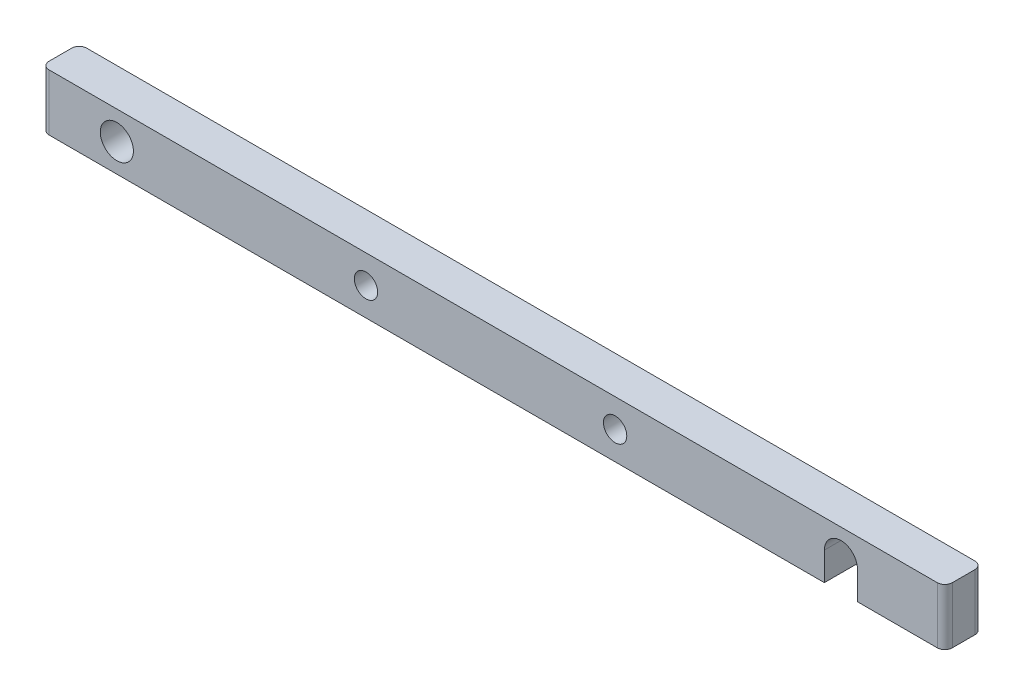
ISO-10303-21;
HEADER;
FILE_DESCRIPTION(('STEP AP214'),'2;1');
FILE_NAME('part.step','',(''),(''),'','','');
FILE_SCHEMA(('AUTOMOTIVE_DESIGN { 1 0 10303 214 1 1 1 1 }'));
ENDSEC;
DATA;
#1=APPLICATION_CONTEXT('core data for automotive mechanical design processes');
#2=APPLICATION_PROTOCOL_DEFINITION('international standard','automotive_design',2000,#1);
#3=PRODUCT_CONTEXT('',#1,'mechanical');
#4=PRODUCT('Part','Part','',(#3));
#5=PRODUCT_RELATED_PRODUCT_CATEGORY('part','',(#4));
#6=PRODUCT_DEFINITION_FORMATION('','',#4);
#7=PRODUCT_DEFINITION_CONTEXT('part definition',#1,'design');
#8=PRODUCT_DEFINITION('design','',#6,#7);
#9=PRODUCT_DEFINITION_SHAPE('','',#8);
#10=(LENGTH_UNIT() NAMED_UNIT(*) SI_UNIT(.MILLI.,.METRE.));
#11=(NAMED_UNIT(*) PLANE_ANGLE_UNIT() SI_UNIT($,.RADIAN.));
#12=(NAMED_UNIT(*) SI_UNIT($,.STERADIAN.) SOLID_ANGLE_UNIT());
#13=UNCERTAINTY_MEASURE_WITH_UNIT(LENGTH_MEASURE(1.E-05),#10,'distance_accuracy_value','');
#14=(GEOMETRIC_REPRESENTATION_CONTEXT(3) GLOBAL_UNCERTAINTY_ASSIGNED_CONTEXT((#13)) GLOBAL_UNIT_ASSIGNED_CONTEXT((#10,
#11,#12)) REPRESENTATION_CONTEXT('',''));
#15=CARTESIAN_POINT('',(0.,0.,0.));
#16=DIRECTION('',(0.,0.,1.));
#17=DIRECTION('',(1.,0.,0.));
#18=AXIS2_PLACEMENT_3D('',#15,#16,#17);
#19=CARTESIAN_POINT('',(-152.4,-9.525,6.35));
#20=DIRECTION('',(0.,1.,0.));
#21=DIRECTION('',(0.,0.,1.));
#22=AXIS2_PLACEMENT_3D('',#19,#20,#21);
#23=PLANE('',#22);
#24=DIRECTION('',(1.,0.,0.));
#25=VECTOR('',#24,1.);
#26=CARTESIAN_POINT('',(-152.4,-9.525,-6.35));
#27=LINE('',#26,#25);
#28=CARTESIAN_POINT('',(122.936,-9.525,-6.35));
#29=VERTEX_POINT('',#28);
#30=CARTESIAN_POINT('',(149.86,-9.525,-6.35));
#31=VERTEX_POINT('',#30);
#32=EDGE_CURVE('E143',#29,#31,#27,.T.);
#33=ORIENTED_EDGE('',*,*,#32,.T.);
#34=CARTESIAN_POINT('',(149.86,-9.525,-3.81));
#35=DIRECTION('',(0.,1.,0.));
#36=DIRECTION('',(0.,0.,1.));
#37=AXIS2_PLACEMENT_3D('',#34,#35,#36);
#38=CIRCLE('',#37,2.54);
#39=CARTESIAN_POINT('',(152.4,-9.525,-3.81));
#40=VERTEX_POINT('',#39);
#41=EDGE_CURVE('E11',#31,#40,#38,.F.);
#42=ORIENTED_EDGE('',*,*,#41,.T.);
#43=DIRECTION('',(0.,0.,-1.));
#44=VECTOR('',#43,1.);
#45=CARTESIAN_POINT('',(152.4,-9.525,6.35));
#46=LINE('',#45,#44);
#47=CARTESIAN_POINT('',(152.4,-9.525,3.81));
#48=VERTEX_POINT('',#47);
#49=EDGE_CURVE('E166',#48,#40,#46,.T.);
#50=ORIENTED_EDGE('',*,*,#49,.F.);
#51=CARTESIAN_POINT('',(149.86,-9.525,3.81));
#52=DIRECTION('',(0.,1.,0.));
#53=DIRECTION('',(0.,0.,1.));
#54=AXIS2_PLACEMENT_3D('',#51,#52,#53);
#55=CIRCLE('',#54,2.54);
#56=CARTESIAN_POINT('',(149.86,-9.525,6.35));
#57=VERTEX_POINT('',#56);
#58=EDGE_CURVE('E48',#48,#57,#55,.F.);
#59=ORIENTED_EDGE('',*,*,#58,.T.);
#60=DIRECTION('',(1.,0.,0.));
#61=VECTOR('',#60,1.);
#62=CARTESIAN_POINT('',(-152.4,-9.525,6.35));
#63=LINE('',#62,#61);
#64=CARTESIAN_POINT('',(122.936,-9.525,6.35));
#65=VERTEX_POINT('',#64);
#66=EDGE_CURVE('E145',#65,#57,#63,.T.);
#67=ORIENTED_EDGE('',*,*,#66,.F.);
#68=DIRECTION('',(0.,0.,1.));
#69=VECTOR('',#68,1.);
#70=CARTESIAN_POINT('',(122.936,-9.525,-6.35));
#71=LINE('',#70,#69);
#72=EDGE_CURVE('E132',#29,#65,#71,.T.);
#73=ORIENTED_EDGE('',*,*,#72,.F.);
#74=EDGE_LOOP('',(#33,#42,#50,#59,#67,#73));
#75=FACE_BOUND('',#74,.T.);
#76=ADVANCED_FACE('F39',(#75),#23,.F.);
#77=CARTESIAN_POINT('',(152.4,-9.525,6.35));
#78=DIRECTION('',(-1.,0.,0.));
#79=DIRECTION('',(0.,0.,1.));
#80=AXIS2_PLACEMENT_3D('',#77,#78,#79);
#81=PLANE('',#80);
#82=ORIENTED_EDGE('',*,*,#49,.T.);
#83=DIRECTION('',(0.,1.,0.));
#84=VECTOR('',#83,1.);
#85=CARTESIAN_POINT('',(152.4,9.525,-3.81));
#86=LINE('',#85,#84);
#87=CARTESIAN_POINT('',(152.4,9.525,-3.81));
#88=VERTEX_POINT('',#87);
#89=EDGE_CURVE('E228',#40,#88,#86,.T.);
#90=ORIENTED_EDGE('',*,*,#89,.T.);
#91=DIRECTION('',(0.,0.,-1.));
#92=VECTOR('',#91,1.);
#93=CARTESIAN_POINT('',(152.4,9.525,6.35));
#94=LINE('',#93,#92);
#95=CARTESIAN_POINT('',(152.4,9.525,3.81));
#96=VERTEX_POINT('',#95);
#97=EDGE_CURVE('E178',#96,#88,#94,.T.);
#98=ORIENTED_EDGE('',*,*,#97,.F.);
#99=DIRECTION('',(0.,1.,0.));
#100=VECTOR('',#99,1.);
#101=CARTESIAN_POINT('',(152.4,-9.525,3.81));
#102=LINE('',#101,#100);
#103=EDGE_CURVE('E60',#96,#48,#102,.F.);
#104=ORIENTED_EDGE('',*,*,#103,.T.);
#105=EDGE_LOOP('',(#82,#90,#98,#104));
#106=FACE_BOUND('',#105,.T.);
#107=ADVANCED_FACE('F243',(#106),#81,.F.);
#108=CARTESIAN_POINT('',(-152.4,9.525,6.35));
#109=DIRECTION('',(0.,-1.,0.));
#110=DIRECTION('',(0.,0.,-1.));
#111=AXIS2_PLACEMENT_3D('',#108,#109,#110);
#112=PLANE('',#111);
#113=DIRECTION('',(-1.,0.,0.));
#114=VECTOR('',#113,1.);
#115=CARTESIAN_POINT('',(-152.4,9.525,-6.35));
#116=LINE('',#115,#114);
#117=CARTESIAN_POINT('',(149.86,9.525,-6.35));
#118=VERTEX_POINT('',#117);
#119=CARTESIAN_POINT('',(-149.86,9.525,-6.35));
#120=VERTEX_POINT('',#119);
#121=EDGE_CURVE('E156',#118,#120,#116,.T.);
#122=ORIENTED_EDGE('',*,*,#121,.T.);
#123=CARTESIAN_POINT('',(-149.86,9.525,-3.81));
#124=DIRECTION('',(0.,-1.,0.));
#125=DIRECTION('',(0.,0.,-1.));
#126=AXIS2_PLACEMENT_3D('',#123,#124,#125);
#127=CIRCLE('',#126,2.54);
#128=CARTESIAN_POINT('',(-152.4,9.525,-3.81));
#129=VERTEX_POINT('',#128);
#130=EDGE_CURVE('E215',#120,#129,#127,.F.);
#131=ORIENTED_EDGE('',*,*,#130,.T.);
#132=DIRECTION('',(0.,0.,-1.));
#133=VECTOR('',#132,1.);
#134=CARTESIAN_POINT('',(-152.4,9.525,6.35));
#135=LINE('',#134,#133);
#136=CARTESIAN_POINT('',(-152.4,9.525,3.81));
#137=VERTEX_POINT('',#136);
#138=EDGE_CURVE('E174',#137,#129,#135,.T.);
#139=ORIENTED_EDGE('',*,*,#138,.F.);
#140=CARTESIAN_POINT('',(-149.86,9.525,3.81));
#141=DIRECTION('',(0.,-1.,0.));
#142=DIRECTION('',(0.,0.,-1.));
#143=AXIS2_PLACEMENT_3D('',#140,#141,#142);
#144=CIRCLE('',#143,2.54);
#145=CARTESIAN_POINT('',(-149.86,9.525,6.35));
#146=VERTEX_POINT('',#145);
#147=EDGE_CURVE('E212',#137,#146,#144,.F.);
#148=ORIENTED_EDGE('',*,*,#147,.T.);
#149=DIRECTION('',(-1.,0.,0.));
#150=VECTOR('',#149,1.);
#151=CARTESIAN_POINT('',(-152.4,9.525,6.35));
#152=LINE('',#151,#150);
#153=CARTESIAN_POINT('',(149.86,9.525,6.35));
#154=VERTEX_POINT('',#153);
#155=EDGE_CURVE('E160',#154,#146,#152,.T.);
#156=ORIENTED_EDGE('',*,*,#155,.F.);
#157=CARTESIAN_POINT('',(149.86,9.525,3.81));
#158=DIRECTION('',(0.,-1.,0.));
#159=DIRECTION('',(0.,0.,-1.));
#160=AXIS2_PLACEMENT_3D('',#157,#158,#159);
#161=CIRCLE('',#160,2.54);
#162=EDGE_CURVE('E206',#154,#96,#161,.F.);
#163=ORIENTED_EDGE('',*,*,#162,.T.);
#164=ORIENTED_EDGE('',*,*,#97,.T.);
#165=CARTESIAN_POINT('',(149.86,9.525,-3.81));
#166=DIRECTION('',(0.,-1.,0.));
#167=DIRECTION('',(0.,0.,-1.));
#168=AXIS2_PLACEMENT_3D('',#165,#166,#167);
#169=CIRCLE('',#168,2.54);
#170=EDGE_CURVE('E209',#88,#118,#169,.F.);
#171=ORIENTED_EDGE('',*,*,#170,.T.);
#172=EDGE_LOOP('',(#122,#131,#139,#148,#156,#163,#164,#171));
#173=FACE_BOUND('',#172,.T.);
#174=ADVANCED_FACE('F242',(#173),#112,.F.);
#175=CARTESIAN_POINT('',(-152.4,-9.525,6.35));
#176=DIRECTION('',(1.,0.,0.));
#177=DIRECTION('',(0.,0.,-1.));
#178=AXIS2_PLACEMENT_3D('',#175,#176,#177);
#179=PLANE('',#178);
#180=ORIENTED_EDGE('',*,*,#138,.T.);
#181=DIRECTION('',(0.,-1.,0.));
#182=VECTOR('',#181,1.);
#183=CARTESIAN_POINT('',(-152.4,-9.525,-3.81));
#184=LINE('',#183,#182);
#185=CARTESIAN_POINT('',(-152.4,-9.525,-3.81));
#186=VERTEX_POINT('',#185);
#187=EDGE_CURVE('E191',#129,#186,#184,.T.);
#188=ORIENTED_EDGE('',*,*,#187,.T.);
#189=DIRECTION('',(0.,0.,-1.));
#190=VECTOR('',#189,1.);
#191=CARTESIAN_POINT('',(-152.4,-9.525,6.35));
#192=LINE('',#191,#190);
#193=CARTESIAN_POINT('',(-152.4,-9.525,3.81));
#194=VERTEX_POINT('',#193);
#195=EDGE_CURVE('E169',#194,#186,#192,.T.);
#196=ORIENTED_EDGE('',*,*,#195,.F.);
#197=DIRECTION('',(0.,-1.,0.));
#198=VECTOR('',#197,1.);
#199=CARTESIAN_POINT('',(-152.4,-9.525,3.81));
#200=LINE('',#199,#198);
#201=EDGE_CURVE('E182',#194,#137,#200,.F.);
#202=ORIENTED_EDGE('',*,*,#201,.T.);
#203=EDGE_LOOP('',(#180,#188,#196,#202));
#204=FACE_BOUND('',#203,.T.);
#205=ADVANCED_FACE('F256',(#204),#179,.F.);
#206=ORIENTED_EDGE('',*,*,#195,.T.);
#207=CARTESIAN_POINT('',(-149.86,-9.525,-3.81));
#208=DIRECTION('',(0.,1.,0.));
#209=DIRECTION('',(0.,0.,1.));
#210=AXIS2_PLACEMENT_3D('',#207,#208,#209);
#211=CIRCLE('',#210,2.54);
#212=CARTESIAN_POINT('',(-149.86,-9.525,-6.35));
#213=VERTEX_POINT('',#212);
#214=EDGE_CURVE('E198',#186,#213,#211,.F.);
#215=ORIENTED_EDGE('',*,*,#214,.T.);
#216=CARTESIAN_POINT('',(111.76,-9.525,-6.35));
#217=VERTEX_POINT('',#216);
#218=EDGE_CURVE('E155',#213,#217,#27,.T.);
#219=ORIENTED_EDGE('',*,*,#218,.T.);
#220=DIRECTION('',(0.,0.,1.));
#221=VECTOR('',#220,1.);
#222=CARTESIAN_POINT('',(111.76,-9.525,-6.35));
#223=LINE('',#222,#221);
#224=CARTESIAN_POINT('',(111.76,-9.525,6.35));
#225=VERTEX_POINT('',#224);
#226=EDGE_CURVE('E276',#217,#225,#223,.T.);
#227=ORIENTED_EDGE('',*,*,#226,.T.);
#228=CARTESIAN_POINT('',(-149.86,-9.525,6.35));
#229=VERTEX_POINT('',#228);
#230=EDGE_CURVE('E170',#229,#225,#63,.T.);
#231=ORIENTED_EDGE('',*,*,#230,.F.);
#232=CARTESIAN_POINT('',(-149.86,-9.525,3.81));
#233=DIRECTION('',(0.,1.,0.));
#234=DIRECTION('',(0.,0.,1.));
#235=AXIS2_PLACEMENT_3D('',#232,#233,#234);
#236=CIRCLE('',#235,2.54);
#237=EDGE_CURVE('E195',#229,#194,#236,.F.);
#238=ORIENTED_EDGE('',*,*,#237,.T.);
#239=EDGE_LOOP('',(#206,#215,#219,#227,#231,#238));
#240=FACE_BOUND('',#239,.T.);
#241=ADVANCED_FACE('F281',(#240),#23,.F.);
#242=CARTESIAN_POINT('',(0.,0.,6.35));
#243=DIRECTION('',(0.,0.,-1.));
#244=DIRECTION('',(-1.,0.,0.));
#245=AXIS2_PLACEMENT_3D('',#242,#243,#244);
#246=PLANE('',#245);
#247=CARTESIAN_POINT('',(-127.,0.,6.35));
#248=DIRECTION('',(0.,0.,-1.));
#249=DIRECTION('',(-1.,0.,0.));
#250=AXIS2_PLACEMENT_3D('',#247,#248,#249);
#251=CIRCLE('',#250,5.58799999999999);
#252=CARTESIAN_POINT('',(-132.588,0.,6.35));
#253=VERTEX_POINT('',#252);
#254=EDGE_CURVE('E162',#253,#253,#251,.T.);
#255=ORIENTED_EDGE('',*,*,#254,.T.);
#256=EDGE_LOOP('',(#255));
#257=FACE_BOUND('',#256,.T.);
#258=CARTESIAN_POINT('',(-42.9260000000001,0.,6.35));
#259=DIRECTION('',(0.,0.,-1.));
#260=DIRECTION('',(-1.,0.,0.));
#261=AXIS2_PLACEMENT_3D('',#258,#259,#260);
#262=CIRCLE('',#261,3.937);
#263=CARTESIAN_POINT('',(-46.8630000000001,0.,6.35));
#264=VERTEX_POINT('',#263);
#265=EDGE_CURVE('E301',#264,#264,#262,.T.);
#266=ORIENTED_EDGE('',*,*,#265,.T.);
#267=EDGE_LOOP('',(#266));
#268=FACE_BOUND('',#267,.T.);
#269=CARTESIAN_POINT('',(41.1479999999999,0.,6.35));
#270=DIRECTION('',(0.,0.,-1.));
#271=DIRECTION('',(-1.,0.,0.));
#272=AXIS2_PLACEMENT_3D('',#269,#270,#271);
#273=CIRCLE('',#272,3.93699999999999);
#274=CARTESIAN_POINT('',(37.2109999999999,0.,6.35));
#275=VERTEX_POINT('',#274);
#276=EDGE_CURVE('E279',#275,#275,#273,.T.);
#277=ORIENTED_EDGE('',*,*,#276,.T.);
#278=EDGE_LOOP('',(#277));
#279=FACE_BOUND('',#278,.T.);
#280=ORIENTED_EDGE('',*,*,#155,.T.);
#281=DIRECTION('',(0.,-1.,0.));
#282=VECTOR('',#281,1.);
#283=CARTESIAN_POINT('',(-149.86,0.,6.35));
#284=LINE('',#283,#282);
#285=EDGE_CURVE('E222',#146,#229,#284,.T.);
#286=ORIENTED_EDGE('',*,*,#285,.T.);
#287=ORIENTED_EDGE('',*,*,#230,.T.);
#288=DIRECTION('',(0.,1.,0.));
#289=VECTOR('',#288,1.);
#290=CARTESIAN_POINT('',(111.76,0.,6.35));
#291=LINE('',#290,#289);
#292=CARTESIAN_POINT('',(111.76,0.,6.35));
#293=VERTEX_POINT('',#292);
#294=EDGE_CURVE('E187',#225,#293,#291,.T.);
#295=ORIENTED_EDGE('',*,*,#294,.T.);
#296=CARTESIAN_POINT('',(117.348,0.,6.35));
#297=DIRECTION('',(0.,0.,1.));
#298=DIRECTION('',(1.,0.,0.));
#299=AXIS2_PLACEMENT_3D('',#296,#297,#298);
#300=CIRCLE('',#299,5.588);
#301=CARTESIAN_POINT('',(122.936,0.,6.35));
#302=VERTEX_POINT('',#301);
#303=EDGE_CURVE('E183',#302,#293,#300,.T.);
#304=ORIENTED_EDGE('',*,*,#303,.F.);
#305=DIRECTION('',(0.,1.,0.));
#306=VECTOR('',#305,1.);
#307=CARTESIAN_POINT('',(122.936,0.,6.35));
#308=LINE('',#307,#306);
#309=EDGE_CURVE('E188',#65,#302,#308,.T.);
#310=ORIENTED_EDGE('',*,*,#309,.F.);
#311=ORIENTED_EDGE('',*,*,#66,.T.);
#312=DIRECTION('',(0.,1.,0.));
#313=VECTOR('',#312,1.);
#314=CARTESIAN_POINT('',(149.86,0.,6.35));
#315=LINE('',#314,#313);
#316=EDGE_CURVE('E218',#57,#154,#315,.T.);
#317=ORIENTED_EDGE('',*,*,#316,.T.);
#318=EDGE_LOOP('',(#280,#286,#287,#295,#304,#310,#311,#317));
#319=FACE_BOUND('',#318,.T.);
#320=ADVANCED_FACE('F237',(#257,#268,#279,#319),#246,.F.);
#321=CARTESIAN_POINT('',(0.,0.,-6.35));
#322=DIRECTION('',(0.,0.,-1.));
#323=DIRECTION('',(-1.,0.,0.));
#324=AXIS2_PLACEMENT_3D('',#321,#322,#323);
#325=PLANE('',#324);
#326=CARTESIAN_POINT('',(-127.,0.,-6.35));
#327=DIRECTION('',(0.,0.,1.));
#328=DIRECTION('',(1.,0.,0.));
#329=AXIS2_PLACEMENT_3D('',#326,#327,#328);
#330=CIRCLE('',#329,5.58799999999999);
#331=CARTESIAN_POINT('',(-121.412,0.,-6.35));
#332=VERTEX_POINT('',#331);
#333=EDGE_CURVE('E297',#332,#332,#330,.T.);
#334=ORIENTED_EDGE('',*,*,#333,.T.);
#335=EDGE_LOOP('',(#334));
#336=FACE_BOUND('',#335,.T.);
#337=CARTESIAN_POINT('',(-42.9260000000001,0.,-6.35));
#338=DIRECTION('',(0.,0.,1.));
#339=DIRECTION('',(1.,0.,0.));
#340=AXIS2_PLACEMENT_3D('',#337,#338,#339);
#341=CIRCLE('',#340,3.937);
#342=CARTESIAN_POINT('',(-38.9890000000001,0.,-6.35));
#343=VERTEX_POINT('',#342);
#344=EDGE_CURVE('E288',#343,#343,#341,.T.);
#345=ORIENTED_EDGE('',*,*,#344,.T.);
#346=EDGE_LOOP('',(#345));
#347=FACE_BOUND('',#346,.T.);
#348=CARTESIAN_POINT('',(41.1479999999999,0.,-6.35));
#349=DIRECTION('',(0.,0.,1.));
#350=DIRECTION('',(1.,0.,0.));
#351=AXIS2_PLACEMENT_3D('',#348,#349,#350);
#352=CIRCLE('',#351,3.93699999999999);
#353=CARTESIAN_POINT('',(45.0849999999999,0.,-6.35));
#354=VERTEX_POINT('',#353);
#355=EDGE_CURVE('E283',#354,#354,#352,.T.);
#356=ORIENTED_EDGE('',*,*,#355,.T.);
#357=EDGE_LOOP('',(#356));
#358=FACE_BOUND('',#357,.T.);
#359=ORIENTED_EDGE('',*,*,#218,.F.);
#360=DIRECTION('',(0.,-1.,0.));
#361=VECTOR('',#360,1.);
#362=CARTESIAN_POINT('',(-149.86,9.525,-6.35));
#363=LINE('',#362,#361);
#364=EDGE_CURVE('E203',#213,#120,#363,.F.);
#365=ORIENTED_EDGE('',*,*,#364,.T.);
#366=ORIENTED_EDGE('',*,*,#121,.F.);
#367=DIRECTION('',(0.,1.,0.));
#368=VECTOR('',#367,1.);
#369=CARTESIAN_POINT('',(149.86,-9.525,-6.35));
#370=LINE('',#369,#368);
#371=EDGE_CURVE('E153',#118,#31,#370,.F.);
#372=ORIENTED_EDGE('',*,*,#371,.T.);
#373=ORIENTED_EDGE('',*,*,#32,.F.);
#374=DIRECTION('',(0.,-1.,0.));
#375=VECTOR('',#374,1.);
#376=CARTESIAN_POINT('',(122.936,0.,-6.35));
#377=LINE('',#376,#375);
#378=CARTESIAN_POINT('',(122.936,0.,-6.35));
#379=VERTEX_POINT('',#378);
#380=EDGE_CURVE('E129',#379,#29,#377,.T.);
#381=ORIENTED_EDGE('',*,*,#380,.F.);
#382=CARTESIAN_POINT('',(117.348,0.,-6.35));
#383=DIRECTION('',(0.,0.,1.));
#384=DIRECTION('',(1.,0.,0.));
#385=AXIS2_PLACEMENT_3D('',#382,#383,#384);
#386=CIRCLE('',#385,5.588);
#387=CARTESIAN_POINT('',(111.76,0.,-6.35));
#388=VERTEX_POINT('',#387);
#389=EDGE_CURVE('E140',#379,#388,#386,.T.);
#390=ORIENTED_EDGE('',*,*,#389,.T.);
#391=DIRECTION('',(0.,-1.,0.));
#392=VECTOR('',#391,1.);
#393=CARTESIAN_POINT('',(111.76,0.,-6.35));
#394=LINE('',#393,#392);
#395=EDGE_CURVE('E147',#388,#217,#394,.T.);
#396=ORIENTED_EDGE('',*,*,#395,.T.);
#397=EDGE_LOOP('',(#359,#365,#366,#372,#373,#381,#390,#396));
#398=FACE_BOUND('',#397,.T.);
#399=ADVANCED_FACE('F150',(#336,#347,#358,#398),#325,.T.);
#400=CARTESIAN_POINT('',(111.76,0.,-6.35));
#401=DIRECTION('',(-1.,0.,0.));
#402=DIRECTION('',(0.,0.,1.));
#403=AXIS2_PLACEMENT_3D('',#400,#401,#402);
#404=PLANE('',#403);
#405=ORIENTED_EDGE('',*,*,#226,.F.);
#406=ORIENTED_EDGE('',*,*,#395,.F.);
#407=DIRECTION('',(0.,0.,1.));
#408=VECTOR('',#407,1.);
#409=CARTESIAN_POINT('',(111.76,0.,-6.35));
#410=LINE('',#409,#408);
#411=EDGE_CURVE('E277',#388,#293,#410,.T.);
#412=ORIENTED_EDGE('',*,*,#411,.T.);
#413=ORIENTED_EDGE('',*,*,#294,.F.);
#414=EDGE_LOOP('',(#405,#406,#412,#413));
#415=FACE_BOUND('',#414,.T.);
#416=ADVANCED_FACE('F274',(#415),#404,.F.);
#417=CARTESIAN_POINT('',(117.348,0.,-6.35));
#418=DIRECTION('',(0.,0.,1.));
#419=DIRECTION('',(1.,0.,0.));
#420=AXIS2_PLACEMENT_3D('',#417,#418,#419);
#421=CYLINDRICAL_SURFACE('',#420,5.588);
#422=ORIENTED_EDGE('',*,*,#411,.F.);
#423=ORIENTED_EDGE('',*,*,#389,.F.);
#424=DIRECTION('',(0.,0.,1.));
#425=VECTOR('',#424,1.);
#426=CARTESIAN_POINT('',(122.936,0.,-6.35));
#427=LINE('',#426,#425);
#428=EDGE_CURVE('E135',#379,#302,#427,.T.);
#429=ORIENTED_EDGE('',*,*,#428,.T.);
#430=ORIENTED_EDGE('',*,*,#303,.T.);
#431=EDGE_LOOP('',(#422,#423,#429,#430));
#432=FACE_BOUND('',#431,.T.);
#433=ADVANCED_FACE('F435',(#432),#421,.F.);
#434=CARTESIAN_POINT('',(122.936,0.,-6.35));
#435=DIRECTION('',(-1.,0.,0.));
#436=DIRECTION('',(0.,0.,1.));
#437=AXIS2_PLACEMENT_3D('',#434,#435,#436);
#438=PLANE('',#437);
#439=ORIENTED_EDGE('',*,*,#309,.T.);
#440=ORIENTED_EDGE('',*,*,#428,.F.);
#441=ORIENTED_EDGE('',*,*,#380,.T.);
#442=ORIENTED_EDGE('',*,*,#72,.T.);
#443=EDGE_LOOP('',(#439,#440,#441,#442));
#444=FACE_BOUND('',#443,.T.);
#445=ADVANCED_FACE('F131',(#444),#438,.T.);
#446=CARTESIAN_POINT('',(41.1479999999999,0.,-6.35));
#447=DIRECTION('',(0.,0.,1.));
#448=DIRECTION('',(1.,0.,0.));
#449=AXIS2_PLACEMENT_3D('',#446,#447,#448);
#450=CYLINDRICAL_SURFACE('',#449,3.93699999999999);
#451=ORIENTED_EDGE('',*,*,#355,.F.);
#452=EDGE_LOOP('',(#451));
#453=FACE_BOUND('',#452,.T.);
#454=ORIENTED_EDGE('',*,*,#276,.F.);
#455=EDGE_LOOP('',(#454));
#456=FACE_BOUND('',#455,.T.);
#457=ADVANCED_FACE('F321',(#453,#456),#450,.F.);
#458=CARTESIAN_POINT('',(-42.9260000000001,0.,-6.35));
#459=DIRECTION('',(0.,0.,1.));
#460=DIRECTION('',(1.,0.,0.));
#461=AXIS2_PLACEMENT_3D('',#458,#459,#460);
#462=CYLINDRICAL_SURFACE('',#461,3.937);
#463=ORIENTED_EDGE('',*,*,#344,.F.);
#464=EDGE_LOOP('',(#463));
#465=FACE_BOUND('',#464,.T.);
#466=ORIENTED_EDGE('',*,*,#265,.F.);
#467=EDGE_LOOP('',(#466));
#468=FACE_BOUND('',#467,.T.);
#469=ADVANCED_FACE('F313',(#465,#468),#462,.F.);
#470=CARTESIAN_POINT('',(-127.,0.,-6.35));
#471=DIRECTION('',(0.,0.,1.));
#472=DIRECTION('',(1.,0.,0.));
#473=AXIS2_PLACEMENT_3D('',#470,#471,#472);
#474=CYLINDRICAL_SURFACE('',#473,5.58799999999999);
#475=ORIENTED_EDGE('',*,*,#333,.F.);
#476=EDGE_LOOP('',(#475));
#477=FACE_BOUND('',#476,.T.);
#478=ORIENTED_EDGE('',*,*,#254,.F.);
#479=EDGE_LOOP('',(#478));
#480=FACE_BOUND('',#479,.T.);
#481=ADVANCED_FACE('F311',(#477,#480),#474,.F.);
#482=CARTESIAN_POINT('',(-149.86,-9.525,-3.81));
#483=DIRECTION('',(0.,1.,0.));
#484=DIRECTION('',(0.,0.,1.));
#485=AXIS2_PLACEMENT_3D('',#482,#483,#484);
#486=CYLINDRICAL_SURFACE('',#485,2.54);
#487=ORIENTED_EDGE('',*,*,#130,.F.);
#488=ORIENTED_EDGE('',*,*,#364,.F.);
#489=ORIENTED_EDGE('',*,*,#214,.F.);
#490=ORIENTED_EDGE('',*,*,#187,.F.);
#491=EDGE_LOOP('',(#487,#488,#489,#490));
#492=FACE_BOUND('',#491,.T.);
#493=ADVANCED_FACE('F251',(#492),#486,.T.);
#494=CARTESIAN_POINT('',(-149.86,0.,3.81));
#495=DIRECTION('',(0.,-1.,0.));
#496=DIRECTION('',(0.,0.,-1.));
#497=AXIS2_PLACEMENT_3D('',#494,#495,#496);
#498=CYLINDRICAL_SURFACE('',#497,2.54);
#499=ORIENTED_EDGE('',*,*,#147,.F.);
#500=ORIENTED_EDGE('',*,*,#201,.F.);
#501=ORIENTED_EDGE('',*,*,#237,.F.);
#502=ORIENTED_EDGE('',*,*,#285,.F.);
#503=EDGE_LOOP('',(#499,#500,#501,#502));
#504=FACE_BOUND('',#503,.T.);
#505=ADVANCED_FACE('F260',(#504),#498,.T.);
#506=CARTESIAN_POINT('',(149.86,-9.525,-3.81));
#507=DIRECTION('',(0.,-1.,0.));
#508=DIRECTION('',(0.,0.,-1.));
#509=AXIS2_PLACEMENT_3D('',#506,#507,#508);
#510=CYLINDRICAL_SURFACE('',#509,2.54);
#511=ORIENTED_EDGE('',*,*,#41,.F.);
#512=ORIENTED_EDGE('',*,*,#371,.F.);
#513=ORIENTED_EDGE('',*,*,#170,.F.);
#514=ORIENTED_EDGE('',*,*,#89,.F.);
#515=EDGE_LOOP('',(#511,#512,#513,#514));
#516=FACE_BOUND('',#515,.T.);
#517=ADVANCED_FACE('F246',(#516),#510,.T.);
#518=CARTESIAN_POINT('',(149.86,0.,3.81));
#519=DIRECTION('',(0.,1.,0.));
#520=DIRECTION('',(0.,0.,1.));
#521=AXIS2_PLACEMENT_3D('',#518,#519,#520);
#522=CYLINDRICAL_SURFACE('',#521,2.54);
#523=ORIENTED_EDGE('',*,*,#58,.F.);
#524=ORIENTED_EDGE('',*,*,#103,.F.);
#525=ORIENTED_EDGE('',*,*,#162,.F.);
#526=ORIENTED_EDGE('',*,*,#316,.F.);
#527=EDGE_LOOP('',(#523,#524,#525,#526));
#528=FACE_BOUND('',#527,.T.);
#529=ADVANCED_FACE('F41',(#528),#522,.T.);
#530=CLOSED_SHELL('',(#76,#107,#174,#205,#241,#320,#399,#416,#433,#445,#457,#469,#481,#493,#505,
#517,#529));
#531=MANIFOLD_SOLID_BREP('B2',#530);
#532=ADVANCED_BREP_SHAPE_REPRESENTATION('',(#18,#531),#14);
#533=SHAPE_DEFINITION_REPRESENTATION(#9,#532);
ENDSEC;
END-ISO-10303-21;
